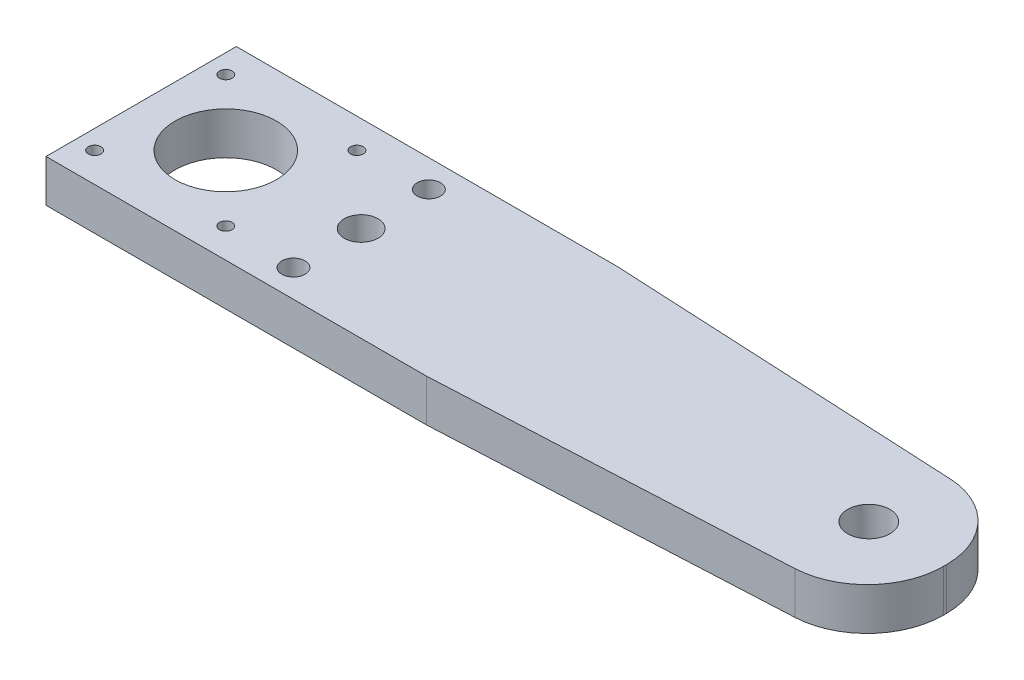
ISO-10303-21;
HEADER;
FILE_DESCRIPTION(('STEP AP214'),'2;1');
FILE_NAME('part.step','',(''),(''),'','','');
FILE_SCHEMA(('AUTOMOTIVE_DESIGN { 1 0 10303 214 1 1 1 1 }'));
ENDSEC;
DATA;
#1=APPLICATION_CONTEXT('core data for automotive mechanical design processes');
#2=APPLICATION_PROTOCOL_DEFINITION('international standard','automotive_design',2000,#1);
#3=PRODUCT_CONTEXT('',#1,'mechanical');
#4=PRODUCT('Part','Part','',(#3));
#5=PRODUCT_RELATED_PRODUCT_CATEGORY('part','',(#4));
#6=PRODUCT_DEFINITION_FORMATION('','',#4);
#7=PRODUCT_DEFINITION_CONTEXT('part definition',#1,'design');
#8=PRODUCT_DEFINITION('design','',#6,#7);
#9=PRODUCT_DEFINITION_SHAPE('','',#8);
#10=(LENGTH_UNIT() NAMED_UNIT(*) SI_UNIT(.MILLI.,.METRE.));
#11=(NAMED_UNIT(*) PLANE_ANGLE_UNIT() SI_UNIT($,.RADIAN.));
#12=(NAMED_UNIT(*) SI_UNIT($,.STERADIAN.) SOLID_ANGLE_UNIT());
#13=UNCERTAINTY_MEASURE_WITH_UNIT(LENGTH_MEASURE(1.E-05),#10,'distance_accuracy_value','');
#14=(GEOMETRIC_REPRESENTATION_CONTEXT(3) GLOBAL_UNCERTAINTY_ASSIGNED_CONTEXT((#13)) GLOBAL_UNIT_ASSIGNED_CONTEXT((#10,
#11,#12)) REPRESENTATION_CONTEXT('',''));
#15=CARTESIAN_POINT('',(0.,0.,0.));
#16=DIRECTION('',(0.,0.,1.));
#17=DIRECTION('',(1.,0.,0.));
#18=AXIS2_PLACEMENT_3D('',#15,#16,#17);
#19=CARTESIAN_POINT('',(95.,10.,-22.5));
#20=DIRECTION('',(-1.,0.,0.));
#21=DIRECTION('',(0.,0.,1.));
#22=AXIS2_PLACEMENT_3D('',#19,#20,#21);
#23=PLANE('',#22);
#24=DIRECTION('',(0.,0.,-1.));
#25=VECTOR('',#24,1.);
#26=CARTESIAN_POINT('',(95.,0.,-22.5));
#27=LINE('',#26,#25);
#28=CARTESIAN_POINT('',(95.,0.,0.377514044949283));
#29=VERTEX_POINT('',#28);
#30=CARTESIAN_POINT('',(95.,0.,-0.377514044949311));
#31=VERTEX_POINT('',#30);
#32=EDGE_CURVE('E139',#29,#31,#27,.T.);
#33=ORIENTED_EDGE('',*,*,#32,.T.);
#34=DIRECTION('',(0.,1.,0.));
#35=VECTOR('',#34,1.);
#36=CARTESIAN_POINT('',(95.,10.,-0.377514044949304));
#37=LINE('',#36,#35);
#38=CARTESIAN_POINT('',(95.,10.,-0.377514044949311));
#39=VERTEX_POINT('',#38);
#40=EDGE_CURVE('E153',#31,#39,#37,.T.);
#41=ORIENTED_EDGE('',*,*,#40,.T.);
#42=DIRECTION('',(0.,0.,-1.));
#43=VECTOR('',#42,1.);
#44=CARTESIAN_POINT('',(95.,10.,-22.5));
#45=LINE('',#44,#43);
#46=CARTESIAN_POINT('',(95.,10.,0.377514044949283));
#47=VERTEX_POINT('',#46);
#48=EDGE_CURVE('E147',#47,#39,#45,.T.);
#49=ORIENTED_EDGE('',*,*,#48,.F.);
#50=DIRECTION('',(0.,1.,0.));
#51=VECTOR('',#50,1.);
#52=CARTESIAN_POINT('',(95.,10.,0.37751404494929));
#53=LINE('',#52,#51);
#54=EDGE_CURVE('E151',#47,#29,#53,.F.);
#55=ORIENTED_EDGE('',*,*,#54,.T.);
#56=EDGE_LOOP('',(#33,#41,#49,#55));
#57=FACE_BOUND('',#56,.T.);
#58=ADVANCED_FACE('F38',(#57),#23,.F.);
#59=CARTESIAN_POINT('',(-95.,10.,-22.5));
#60=DIRECTION('',(0.,0.,1.));
#61=DIRECTION('',(1.,0.,0.));
#62=AXIS2_PLACEMENT_3D('',#59,#60,#61);
#63=PLANE('',#62);
#64=DIRECTION('',(-1.,0.,0.));
#65=VECTOR('',#64,1.);
#66=CARTESIAN_POINT('',(-95.,10.,-22.5));
#67=LINE('',#66,#65);
#68=CARTESIAN_POINT('',(-4.99999999999999,10.,-22.5));
#69=VERTEX_POINT('',#68);
#70=CARTESIAN_POINT('',(-95.,10.,-22.5));
#71=VERTEX_POINT('',#70);
#72=EDGE_CURVE('E135',#69,#71,#67,.T.);
#73=ORIENTED_EDGE('',*,*,#72,.F.);
#74=DIRECTION('',(0.,1.,0.));
#75=VECTOR('',#74,1.);
#76=CARTESIAN_POINT('',(-4.99999999999999,0.,-22.5));
#77=LINE('',#76,#75);
#78=CARTESIAN_POINT('',(-4.99999999999999,0.,-22.5));
#79=VERTEX_POINT('',#78);
#80=EDGE_CURVE('E114',#79,#69,#77,.T.);
#81=ORIENTED_EDGE('',*,*,#80,.F.);
#82=DIRECTION('',(-1.,0.,0.));
#83=VECTOR('',#82,1.);
#84=CARTESIAN_POINT('',(-95.,0.,-22.5));
#85=LINE('',#84,#83);
#86=CARTESIAN_POINT('',(-95.,0.,-22.5));
#87=VERTEX_POINT('',#86);
#88=EDGE_CURVE('E142',#79,#87,#85,.T.);
#89=ORIENTED_EDGE('',*,*,#88,.T.);
#90=DIRECTION('',(0.,-1.,0.));
#91=VECTOR('',#90,1.);
#92=CARTESIAN_POINT('',(-95.,10.,-22.5));
#93=LINE('',#92,#91);
#94=EDGE_CURVE('E133',#71,#87,#93,.T.);
#95=ORIENTED_EDGE('',*,*,#94,.F.);
#96=EDGE_LOOP('',(#73,#81,#89,#95));
#97=FACE_BOUND('',#96,.T.);
#98=ADVANCED_FACE('F234',(#97),#63,.F.);
#99=CARTESIAN_POINT('',(-95.,10.,-22.5));
#100=DIRECTION('',(1.,0.,0.));
#101=DIRECTION('',(0.,0.,-1.));
#102=AXIS2_PLACEMENT_3D('',#99,#100,#101);
#103=PLANE('',#102);
#104=DIRECTION('',(0.,0.,1.));
#105=VECTOR('',#104,1.);
#106=CARTESIAN_POINT('',(-95.,0.,-22.5));
#107=LINE('',#106,#105);
#108=CARTESIAN_POINT('',(-95.,0.,22.5));
#109=VERTEX_POINT('',#108);
#110=EDGE_CURVE('E145',#87,#109,#107,.T.);
#111=ORIENTED_EDGE('',*,*,#110,.T.);
#112=DIRECTION('',(0.,-1.,0.));
#113=VECTOR('',#112,1.);
#114=CARTESIAN_POINT('',(-95.,10.,22.5));
#115=LINE('',#114,#113);
#116=CARTESIAN_POINT('',(-95.,10.,22.5));
#117=VERTEX_POINT('',#116);
#118=EDGE_CURVE('E131',#117,#109,#115,.T.);
#119=ORIENTED_EDGE('',*,*,#118,.F.);
#120=DIRECTION('',(0.,0.,1.));
#121=VECTOR('',#120,1.);
#122=CARTESIAN_POINT('',(-95.,10.,-22.5));
#123=LINE('',#122,#121);
#124=EDGE_CURVE('E129',#71,#117,#123,.T.);
#125=ORIENTED_EDGE('',*,*,#124,.F.);
#126=ORIENTED_EDGE('',*,*,#94,.T.);
#127=EDGE_LOOP('',(#111,#119,#125,#126));
#128=FACE_BOUND('',#127,.T.);
#129=ADVANCED_FACE('F237',(#128),#103,.F.);
#130=CARTESIAN_POINT('',(-95.,10.,22.5));
#131=DIRECTION('',(0.,0.,-1.));
#132=DIRECTION('',(-1.,0.,0.));
#133=AXIS2_PLACEMENT_3D('',#130,#131,#132);
#134=PLANE('',#133);
#135=DIRECTION('',(1.,0.,0.));
#136=VECTOR('',#135,1.);
#137=CARTESIAN_POINT('',(-95.,0.,22.5));
#138=LINE('',#137,#136);
#139=CARTESIAN_POINT('',(-5.00000000001302,0.,22.5000000000003));
#140=VERTEX_POINT('',#139);
#141=EDGE_CURVE('E122',#109,#140,#138,.T.);
#142=ORIENTED_EDGE('',*,*,#141,.T.);
#143=DIRECTION('',(0.,1.,0.));
#144=VECTOR('',#143,1.);
#145=CARTESIAN_POINT('',(-4.99999999999999,0.,22.5));
#146=LINE('',#145,#144);
#147=CARTESIAN_POINT('',(-4.99999999999999,10.,22.5));
#148=VERTEX_POINT('',#147);
#149=EDGE_CURVE('E108',#140,#148,#146,.T.);
#150=ORIENTED_EDGE('',*,*,#149,.T.);
#151=DIRECTION('',(1.,0.,0.));
#152=VECTOR('',#151,1.);
#153=CARTESIAN_POINT('',(-95.,10.,22.5));
#154=LINE('',#153,#152);
#155=EDGE_CURVE('E120',#117,#148,#154,.T.);
#156=ORIENTED_EDGE('',*,*,#155,.F.);
#157=ORIENTED_EDGE('',*,*,#118,.T.);
#158=EDGE_LOOP('',(#142,#150,#156,#157));
#159=FACE_BOUND('',#158,.T.);
#160=ADVANCED_FACE('F118',(#159),#134,.F.);
#161=CARTESIAN_POINT('',(0.,10.,0.));
#162=DIRECTION('',(0.,1.,0.));
#163=DIRECTION('',(0.,0.,1.));
#164=AXIS2_PLACEMENT_3D('',#161,#162,#163);
#165=PLANE('',#164);
#166=ORIENTED_EDGE('',*,*,#48,.T.);
#167=CARTESIAN_POINT('',(77.,10.,-0.377514044949297));
#168=DIRECTION('',(0.,1.,0.));
#169=DIRECTION('',(0.,0.,1.));
#170=AXIS2_PLACEMENT_3D('',#167,#168,#169);
#171=CIRCLE('',#170,18.);
#172=CARTESIAN_POINT('',(77.89887710499,10.,-18.3550561447505));
#173=VERTEX_POINT('',#172);
#174=EDGE_CURVE('E158',#39,#173,#171,.T.);
#175=ORIENTED_EDGE('',*,*,#174,.T.);
#176=DIRECTION('',(0.998752338877845,0.,0.0499376169438922));
#177=VECTOR('',#176,1.);
#178=CARTESIAN_POINT('',(-4.99999999999999,10.,-22.5));
#179=LINE('',#178,#177);
#180=EDGE_CURVE('E172',#69,#173,#179,.T.);
#181=ORIENTED_EDGE('',*,*,#180,.F.);
#182=ORIENTED_EDGE('',*,*,#72,.T.);
#183=ORIENTED_EDGE('',*,*,#124,.T.);
#184=ORIENTED_EDGE('',*,*,#155,.T.);
#185=DIRECTION('',(-0.998752338877845,0.,0.0499376169438922));
#186=VECTOR('',#185,1.);
#187=CARTESIAN_POINT('',(-4.99999999999999,10.,22.5));
#188=LINE('',#187,#186);
#189=CARTESIAN_POINT('',(77.89887710499,10.,18.3550561447505));
#190=VERTEX_POINT('',#189);
#191=EDGE_CURVE('E105',#190,#148,#188,.T.);
#192=ORIENTED_EDGE('',*,*,#191,.F.);
#193=CARTESIAN_POINT('',(77.,10.,0.377514044949297));
#194=DIRECTION('',(0.,1.,0.));
#195=DIRECTION('',(0.,0.,1.));
#196=AXIS2_PLACEMENT_3D('',#193,#194,#195);
#197=CIRCLE('',#196,18.);
#198=EDGE_CURVE('E156',#190,#47,#197,.T.);
#199=ORIENTED_EDGE('',*,*,#198,.T.);
#200=EDGE_LOOP('',(#166,#175,#181,#182,#183,#184,#192,#199));
#201=FACE_BOUND('',#200,.T.);
#202=CARTESIAN_POINT('',(-43.,10.,0.));
#203=DIRECTION('',(0.,1.,0.));
#204=DIRECTION('',(0.,0.,1.));
#205=AXIS2_PLACEMENT_3D('',#202,#203,#204);
#206=CIRCLE('',#205,4.);
#207=CARTESIAN_POINT('',(-43.,10.,4.));
#208=VERTEX_POINT('',#207);
#209=EDGE_CURVE('E220',#208,#208,#206,.T.);
#210=ORIENTED_EDGE('',*,*,#209,.F.);
#211=EDGE_LOOP('',(#210));
#212=FACE_BOUND('',#211,.T.);
#213=CARTESIAN_POINT('',(-43.,10.,-16.));
#214=DIRECTION('',(0.,1.,0.));
#215=DIRECTION('',(0.,0.,1.));
#216=AXIS2_PLACEMENT_3D('',#213,#214,#215);
#217=CIRCLE('',#216,2.75);
#218=CARTESIAN_POINT('',(-43.,10.,-13.25));
#219=VERTEX_POINT('',#218);
#220=EDGE_CURVE('E209',#219,#219,#217,.T.);
#221=ORIENTED_EDGE('',*,*,#220,.F.);
#222=EDGE_LOOP('',(#221));
#223=FACE_BOUND('',#222,.T.);
#224=CARTESIAN_POINT('',(-43.,10.,16.));
#225=DIRECTION('',(0.,1.,0.));
#226=DIRECTION('',(0.,0.,-1.));
#227=AXIS2_PLACEMENT_3D('',#224,#225,#226);
#228=CIRCLE('',#227,2.75);
#229=CARTESIAN_POINT('',(-43.,10.,13.25));
#230=VERTEX_POINT('',#229);
#231=EDGE_CURVE('E210',#230,#230,#228,.T.);
#232=ORIENTED_EDGE('',*,*,#231,.F.);
#233=EDGE_LOOP('',(#232));
#234=FACE_BOUND('',#233,.T.);
#235=CARTESIAN_POINT('',(77.,10.,0.));
#236=DIRECTION('',(0.,1.,0.));
#237=DIRECTION('',(0.,0.,1.));
#238=AXIS2_PLACEMENT_3D('',#235,#236,#237);
#239=CIRCLE('',#238,5.);
#240=CARTESIAN_POINT('',(77.,10.,5.));
#241=VERTEX_POINT('',#240);
#242=EDGE_CURVE('E123',#241,#241,#239,.T.);
#243=ORIENTED_EDGE('',*,*,#242,.F.);
#244=EDGE_LOOP('',(#243));
#245=FACE_BOUND('',#244,.T.);
#246=CARTESIAN_POINT('',(-59.5,10.,-15.5));
#247=DIRECTION('',(0.,1.,0.));
#248=DIRECTION('',(0.,0.,1.));
#249=AXIS2_PLACEMENT_3D('',#246,#247,#248);
#250=CIRCLE('',#249,1.5);
#251=CARTESIAN_POINT('',(-59.5,10.,-14.));
#252=VERTEX_POINT('',#251);
#253=EDGE_CURVE('E198',#252,#252,#250,.T.);
#254=ORIENTED_EDGE('',*,*,#253,.F.);
#255=EDGE_LOOP('',(#254));
#256=FACE_BOUND('',#255,.T.);
#257=CARTESIAN_POINT('',(-90.5,10.,15.5));
#258=DIRECTION('',(0.,1.,0.));
#259=DIRECTION('',(0.,0.,1.));
#260=AXIS2_PLACEMENT_3D('',#257,#258,#259);
#261=CIRCLE('',#260,1.5);
#262=CARTESIAN_POINT('',(-90.5,10.,17.));
#263=VERTEX_POINT('',#262);
#264=EDGE_CURVE('E183',#263,#263,#261,.T.);
#265=ORIENTED_EDGE('',*,*,#264,.F.);
#266=EDGE_LOOP('',(#265));
#267=FACE_BOUND('',#266,.T.);
#268=CARTESIAN_POINT('',(-59.5,10.,15.5));
#269=DIRECTION('',(0.,1.,0.));
#270=DIRECTION('',(0.,0.,1.));
#271=AXIS2_PLACEMENT_3D('',#268,#269,#270);
#272=CIRCLE('',#271,1.5);
#273=CARTESIAN_POINT('',(-59.5,10.,17.));
#274=VERTEX_POINT('',#273);
#275=EDGE_CURVE('E184',#274,#274,#272,.T.);
#276=ORIENTED_EDGE('',*,*,#275,.F.);
#277=EDGE_LOOP('',(#276));
#278=FACE_BOUND('',#277,.T.);
#279=CARTESIAN_POINT('',(-75.,10.,0.));
#280=DIRECTION('',(0.,1.,0.));
#281=DIRECTION('',(0.,0.,1.));
#282=AXIS2_PLACEMENT_3D('',#279,#280,#281);
#283=CIRCLE('',#282,12.);
#284=CARTESIAN_POINT('',(-75.,10.,12.));
#285=VERTEX_POINT('',#284);
#286=EDGE_CURVE('E190',#285,#285,#283,.T.);
#287=ORIENTED_EDGE('',*,*,#286,.F.);
#288=EDGE_LOOP('',(#287));
#289=FACE_BOUND('',#288,.T.);
#290=CARTESIAN_POINT('',(-90.5,10.,-15.5));
#291=DIRECTION('',(0.,1.,0.));
#292=DIRECTION('',(0.,0.,1.));
#293=AXIS2_PLACEMENT_3D('',#290,#291,#292);
#294=CIRCLE('',#293,1.5);
#295=CARTESIAN_POINT('',(-90.5,10.,-14.));
#296=VERTEX_POINT('',#295);
#297=EDGE_CURVE('E197',#296,#296,#294,.T.);
#298=ORIENTED_EDGE('',*,*,#297,.F.);
#299=EDGE_LOOP('',(#298));
#300=FACE_BOUND('',#299,.T.);
#301=ADVANCED_FACE('F126',(#201,#212,#223,#234,#245,#256,#267,#278,#289,#300),#165,.T.);
#302=CARTESIAN_POINT('',(0.,0.,0.));
#303=DIRECTION('',(0.,1.,0.));
#304=DIRECTION('',(0.,0.,1.));
#305=AXIS2_PLACEMENT_3D('',#302,#303,#304);
#306=PLANE('',#305);
#307=CARTESIAN_POINT('',(-43.,0.,0.));
#308=DIRECTION('',(0.,1.,0.));
#309=DIRECTION('',(0.,0.,1.));
#310=AXIS2_PLACEMENT_3D('',#307,#308,#309);
#311=CIRCLE('',#310,4.);
#312=CARTESIAN_POINT('',(-43.,0.,4.));
#313=VERTEX_POINT('',#312);
#314=EDGE_CURVE('E193',#313,#313,#311,.T.);
#315=ORIENTED_EDGE('',*,*,#314,.T.);
#316=EDGE_LOOP('',(#315));
#317=FACE_BOUND('',#316,.T.);
#318=CARTESIAN_POINT('',(-43.,0.,-16.));
#319=DIRECTION('',(0.,1.,0.));
#320=DIRECTION('',(0.,0.,1.));
#321=AXIS2_PLACEMENT_3D('',#318,#319,#320);
#322=CIRCLE('',#321,2.75);
#323=CARTESIAN_POINT('',(-43.,0.,-13.25));
#324=VERTEX_POINT('',#323);
#325=EDGE_CURVE('E223',#324,#324,#322,.T.);
#326=ORIENTED_EDGE('',*,*,#325,.T.);
#327=EDGE_LOOP('',(#326));
#328=FACE_BOUND('',#327,.T.);
#329=CARTESIAN_POINT('',(-43.,0.,16.));
#330=DIRECTION('',(0.,1.,0.));
#331=DIRECTION('',(0.,0.,-1.));
#332=AXIS2_PLACEMENT_3D('',#329,#330,#331);
#333=CIRCLE('',#332,2.75);
#334=CARTESIAN_POINT('',(-43.,0.,13.25));
#335=VERTEX_POINT('',#334);
#336=EDGE_CURVE('E206',#335,#335,#333,.T.);
#337=ORIENTED_EDGE('',*,*,#336,.T.);
#338=EDGE_LOOP('',(#337));
#339=FACE_BOUND('',#338,.T.);
#340=CARTESIAN_POINT('',(77.,0.,0.));
#341=DIRECTION('',(0.,1.,0.));
#342=DIRECTION('',(0.,0.,1.));
#343=AXIS2_PLACEMENT_3D('',#340,#341,#342);
#344=CIRCLE('',#343,5.);
#345=CARTESIAN_POINT('',(77.,0.,5.));
#346=VERTEX_POINT('',#345);
#347=EDGE_CURVE('E213',#346,#346,#344,.T.);
#348=ORIENTED_EDGE('',*,*,#347,.T.);
#349=EDGE_LOOP('',(#348));
#350=FACE_BOUND('',#349,.T.);
#351=CARTESIAN_POINT('',(-59.5,0.,-15.5));
#352=DIRECTION('',(0.,1.,0.));
#353=DIRECTION('',(0.,0.,1.));
#354=AXIS2_PLACEMENT_3D('',#351,#352,#353);
#355=CIRCLE('',#354,1.5);
#356=CARTESIAN_POINT('',(-59.5,0.,-14.));
#357=VERTEX_POINT('',#356);
#358=EDGE_CURVE('E194',#357,#357,#355,.T.);
#359=ORIENTED_EDGE('',*,*,#358,.T.);
#360=EDGE_LOOP('',(#359));
#361=FACE_BOUND('',#360,.T.);
#362=CARTESIAN_POINT('',(-90.5,0.,15.5));
#363=DIRECTION('',(0.,1.,0.));
#364=DIRECTION('',(0.,0.,1.));
#365=AXIS2_PLACEMENT_3D('',#362,#363,#364);
#366=CIRCLE('',#365,1.5);
#367=CARTESIAN_POINT('',(-90.5,0.,17.));
#368=VERTEX_POINT('',#367);
#369=EDGE_CURVE('E201',#368,#368,#366,.T.);
#370=ORIENTED_EDGE('',*,*,#369,.T.);
#371=EDGE_LOOP('',(#370));
#372=FACE_BOUND('',#371,.T.);
#373=CARTESIAN_POINT('',(-59.5,0.,15.5));
#374=DIRECTION('',(0.,1.,0.));
#375=DIRECTION('',(0.,0.,1.));
#376=AXIS2_PLACEMENT_3D('',#373,#374,#375);
#377=CIRCLE('',#376,1.5);
#378=CARTESIAN_POINT('',(-59.5,0.,17.));
#379=VERTEX_POINT('',#378);
#380=EDGE_CURVE('E180',#379,#379,#377,.T.);
#381=ORIENTED_EDGE('',*,*,#380,.T.);
#382=EDGE_LOOP('',(#381));
#383=FACE_BOUND('',#382,.T.);
#384=CARTESIAN_POINT('',(-75.,0.,0.));
#385=DIRECTION('',(0.,1.,0.));
#386=DIRECTION('',(0.,0.,1.));
#387=AXIS2_PLACEMENT_3D('',#384,#385,#386);
#388=CIRCLE('',#387,12.);
#389=CARTESIAN_POINT('',(-75.,0.,12.));
#390=VERTEX_POINT('',#389);
#391=EDGE_CURVE('E187',#390,#390,#388,.T.);
#392=ORIENTED_EDGE('',*,*,#391,.T.);
#393=EDGE_LOOP('',(#392));
#394=FACE_BOUND('',#393,.T.);
#395=CARTESIAN_POINT('',(-90.5,0.,-15.5));
#396=DIRECTION('',(0.,1.,0.));
#397=DIRECTION('',(0.,0.,1.));
#398=AXIS2_PLACEMENT_3D('',#395,#396,#397);
#399=CIRCLE('',#398,1.5);
#400=CARTESIAN_POINT('',(-90.5,0.,-14.));
#401=VERTEX_POINT('',#400);
#402=EDGE_CURVE('E143',#401,#401,#399,.T.);
#403=ORIENTED_EDGE('',*,*,#402,.T.);
#404=EDGE_LOOP('',(#403));
#405=FACE_BOUND('',#404,.T.);
#406=DIRECTION('',(0.998752338877845,0.,0.0499376169438922));
#407=VECTOR('',#406,1.);
#408=CARTESIAN_POINT('',(-4.99999999999999,0.,-22.5));
#409=LINE('',#408,#407);
#410=CARTESIAN_POINT('',(77.89887710499,0.,-18.3550561447505));
#411=VERTEX_POINT('',#410);
#412=EDGE_CURVE('E164',#79,#411,#409,.T.);
#413=ORIENTED_EDGE('',*,*,#412,.T.);
#414=CARTESIAN_POINT('',(77.,0.,-0.377514044949297));
#415=DIRECTION('',(0.,1.,0.));
#416=DIRECTION('',(0.,0.,1.));
#417=AXIS2_PLACEMENT_3D('',#414,#415,#416);
#418=CIRCLE('',#417,18.);
#419=EDGE_CURVE('E46',#411,#31,#418,.F.);
#420=ORIENTED_EDGE('',*,*,#419,.T.);
#421=ORIENTED_EDGE('',*,*,#32,.F.);
#422=CARTESIAN_POINT('',(77.,0.,0.377514044949297));
#423=DIRECTION('',(0.,1.,0.));
#424=DIRECTION('',(0.,0.,1.));
#425=AXIS2_PLACEMENT_3D('',#422,#423,#424);
#426=CIRCLE('',#425,18.);
#427=CARTESIAN_POINT('',(77.89887710499,0.,18.3550561447505));
#428=VERTEX_POINT('',#427);
#429=EDGE_CURVE('E53',#29,#428,#426,.F.);
#430=ORIENTED_EDGE('',*,*,#429,.T.);
#431=DIRECTION('',(-0.998752338877845,0.,0.0499376169438922));
#432=VECTOR('',#431,1.);
#433=CARTESIAN_POINT('',(-4.99999999999999,0.,22.5));
#434=LINE('',#433,#432);
#435=EDGE_CURVE('E113',#428,#140,#434,.T.);
#436=ORIENTED_EDGE('',*,*,#435,.T.);
#437=ORIENTED_EDGE('',*,*,#141,.F.);
#438=ORIENTED_EDGE('',*,*,#110,.F.);
#439=ORIENTED_EDGE('',*,*,#88,.F.);
#440=EDGE_LOOP('',(#413,#420,#421,#430,#436,#437,#438,#439));
#441=FACE_BOUND('',#440,.T.);
#442=ADVANCED_FACE('F162',(#317,#328,#339,#350,#361,#372,#383,#394,#405,#441),#306,.F.);
#443=CARTESIAN_POINT('',(-90.5,0.,-15.5));
#444=DIRECTION('',(0.,1.,0.));
#445=DIRECTION('',(0.,0.,1.));
#446=AXIS2_PLACEMENT_3D('',#443,#444,#445);
#447=CYLINDRICAL_SURFACE('',#446,1.5);
#448=ORIENTED_EDGE('',*,*,#402,.F.);
#449=EDGE_LOOP('',(#448));
#450=FACE_BOUND('',#449,.T.);
#451=ORIENTED_EDGE('',*,*,#297,.T.);
#452=EDGE_LOOP('',(#451));
#453=FACE_BOUND('',#452,.T.);
#454=ADVANCED_FACE('F257',(#450,#453),#447,.F.);
#455=CARTESIAN_POINT('',(-75.,0.,0.));
#456=DIRECTION('',(0.,1.,0.));
#457=DIRECTION('',(0.,0.,1.));
#458=AXIS2_PLACEMENT_3D('',#455,#456,#457);
#459=CYLINDRICAL_SURFACE('',#458,12.);
#460=ORIENTED_EDGE('',*,*,#391,.F.);
#461=EDGE_LOOP('',(#460));
#462=FACE_BOUND('',#461,.T.);
#463=ORIENTED_EDGE('',*,*,#286,.T.);
#464=EDGE_LOOP('',(#463));
#465=FACE_BOUND('',#464,.T.);
#466=ADVANCED_FACE('F263',(#462,#465),#459,.F.);
#467=CARTESIAN_POINT('',(-59.5,0.,15.5));
#468=DIRECTION('',(0.,1.,0.));
#469=DIRECTION('',(0.,0.,1.));
#470=AXIS2_PLACEMENT_3D('',#467,#468,#469);
#471=CYLINDRICAL_SURFACE('',#470,1.5);
#472=ORIENTED_EDGE('',*,*,#380,.F.);
#473=EDGE_LOOP('',(#472));
#474=FACE_BOUND('',#473,.T.);
#475=ORIENTED_EDGE('',*,*,#275,.T.);
#476=EDGE_LOOP('',(#475));
#477=FACE_BOUND('',#476,.T.);
#478=ADVANCED_FACE('F285',(#474,#477),#471,.F.);
#479=CARTESIAN_POINT('',(-90.5,0.,15.5));
#480=DIRECTION('',(0.,1.,0.));
#481=DIRECTION('',(0.,0.,1.));
#482=AXIS2_PLACEMENT_3D('',#479,#480,#481);
#483=CYLINDRICAL_SURFACE('',#482,1.5);
#484=ORIENTED_EDGE('',*,*,#369,.F.);
#485=EDGE_LOOP('',(#484));
#486=FACE_BOUND('',#485,.T.);
#487=ORIENTED_EDGE('',*,*,#264,.T.);
#488=EDGE_LOOP('',(#487));
#489=FACE_BOUND('',#488,.T.);
#490=ADVANCED_FACE('F282',(#486,#489),#483,.F.);
#491=CARTESIAN_POINT('',(-59.5,0.,-15.5));
#492=DIRECTION('',(0.,1.,0.));
#493=DIRECTION('',(0.,0.,1.));
#494=AXIS2_PLACEMENT_3D('',#491,#492,#493);
#495=CYLINDRICAL_SURFACE('',#494,1.5);
#496=ORIENTED_EDGE('',*,*,#358,.F.);
#497=EDGE_LOOP('',(#496));
#498=FACE_BOUND('',#497,.T.);
#499=ORIENTED_EDGE('',*,*,#253,.T.);
#500=EDGE_LOOP('',(#499));
#501=FACE_BOUND('',#500,.T.);
#502=ADVANCED_FACE('F277',(#498,#501),#495,.F.);
#503=CARTESIAN_POINT('',(77.,0.,0.));
#504=DIRECTION('',(0.,1.,0.));
#505=DIRECTION('',(0.,0.,1.));
#506=AXIS2_PLACEMENT_3D('',#503,#504,#505);
#507=CYLINDRICAL_SURFACE('',#506,5.);
#508=ORIENTED_EDGE('',*,*,#347,.F.);
#509=EDGE_LOOP('',(#508));
#510=FACE_BOUND('',#509,.T.);
#511=ORIENTED_EDGE('',*,*,#242,.T.);
#512=EDGE_LOOP('',(#511));
#513=FACE_BOUND('',#512,.T.);
#514=ADVANCED_FACE('F274',(#510,#513),#507,.F.);
#515=CARTESIAN_POINT('',(-43.,0.,16.));
#516=DIRECTION('',(0.,1.,0.));
#517=DIRECTION('',(0.,0.,1.));
#518=AXIS2_PLACEMENT_3D('',#515,#516,#517);
#519=CYLINDRICAL_SURFACE('',#518,2.75);
#520=ORIENTED_EDGE('',*,*,#336,.F.);
#521=EDGE_LOOP('',(#520));
#522=FACE_BOUND('',#521,.T.);
#523=ORIENTED_EDGE('',*,*,#231,.T.);
#524=EDGE_LOOP('',(#523));
#525=FACE_BOUND('',#524,.T.);
#526=ADVANCED_FACE('F269',(#522,#525),#519,.F.);
#527=CARTESIAN_POINT('',(-43.,0.,-16.));
#528=DIRECTION('',(0.,1.,0.));
#529=DIRECTION('',(0.,0.,1.));
#530=AXIS2_PLACEMENT_3D('',#527,#528,#529);
#531=CYLINDRICAL_SURFACE('',#530,2.75);
#532=ORIENTED_EDGE('',*,*,#325,.F.);
#533=EDGE_LOOP('',(#532));
#534=FACE_BOUND('',#533,.T.);
#535=ORIENTED_EDGE('',*,*,#220,.T.);
#536=EDGE_LOOP('',(#535));
#537=FACE_BOUND('',#536,.T.);
#538=ADVANCED_FACE('F265',(#534,#537),#531,.F.);
#539=CARTESIAN_POINT('',(-43.,0.,0.));
#540=DIRECTION('',(0.,1.,0.));
#541=DIRECTION('',(0.,0.,1.));
#542=AXIS2_PLACEMENT_3D('',#539,#540,#541);
#543=CYLINDRICAL_SURFACE('',#542,4.);
#544=ORIENTED_EDGE('',*,*,#314,.F.);
#545=EDGE_LOOP('',(#544));
#546=FACE_BOUND('',#545,.T.);
#547=ORIENTED_EDGE('',*,*,#209,.T.);
#548=EDGE_LOOP('',(#547));
#549=FACE_BOUND('',#548,.T.);
#550=ADVANCED_FACE('F268',(#546,#549),#543,.F.);
#551=CARTESIAN_POINT('',(-4.99999999999999,0.,-22.5));
#552=DIRECTION('',(-0.0499376169438922,0.,0.998752338877845));
#553=DIRECTION('',(0.998752338877845,0.,0.0499376169438923));
#554=AXIS2_PLACEMENT_3D('',#551,#552,#553);
#555=PLANE('',#554);
#556=ORIENTED_EDGE('',*,*,#180,.T.);
#557=DIRECTION('',(0.,1.,0.));
#558=VECTOR('',#557,1.);
#559=CARTESIAN_POINT('',(77.8988771049901,0.,-18.3550561447505));
#560=LINE('',#559,#558);
#561=EDGE_CURVE('E61',#173,#411,#560,.F.);
#562=ORIENTED_EDGE('',*,*,#561,.T.);
#563=ORIENTED_EDGE('',*,*,#412,.F.);
#564=ORIENTED_EDGE('',*,*,#80,.T.);
#565=EDGE_LOOP('',(#556,#562,#563,#564));
#566=FACE_BOUND('',#565,.T.);
#567=ADVANCED_FACE('F174',(#566),#555,.F.);
#568=CARTESIAN_POINT('',(-4.99999999999999,0.,22.5));
#569=DIRECTION('',(-0.0499376169438922,0.,-0.998752338877845));
#570=DIRECTION('',(-0.998752338877845,0.,0.0499376169438923));
#571=AXIS2_PLACEMENT_3D('',#568,#569,#570);
#572=PLANE('',#571);
#573=ORIENTED_EDGE('',*,*,#435,.F.);
#574=DIRECTION('',(0.,1.,0.));
#575=VECTOR('',#574,1.);
#576=CARTESIAN_POINT('',(77.8988771049901,0.,18.3550561447505));
#577=LINE('',#576,#575);
#578=EDGE_CURVE('E11',#428,#190,#577,.T.);
#579=ORIENTED_EDGE('',*,*,#578,.T.);
#580=ORIENTED_EDGE('',*,*,#191,.T.);
#581=ORIENTED_EDGE('',*,*,#149,.F.);
#582=EDGE_LOOP('',(#573,#579,#580,#581));
#583=FACE_BOUND('',#582,.T.);
#584=ADVANCED_FACE('F107',(#583),#572,.F.);
#585=CARTESIAN_POINT('',(77.,10.,-0.377514044949297));
#586=DIRECTION('',(0.,1.,0.));
#587=DIRECTION('',(0.,0.,1.));
#588=AXIS2_PLACEMENT_3D('',#585,#586,#587);
#589=CYLINDRICAL_SURFACE('',#588,18.);
#590=ORIENTED_EDGE('',*,*,#419,.F.);
#591=ORIENTED_EDGE('',*,*,#561,.F.);
#592=ORIENTED_EDGE('',*,*,#174,.F.);
#593=ORIENTED_EDGE('',*,*,#40,.F.);
#594=EDGE_LOOP('',(#590,#591,#592,#593));
#595=FACE_BOUND('',#594,.T.);
#596=ADVANCED_FACE('F170',(#595),#589,.T.);
#597=CARTESIAN_POINT('',(77.,0.,0.377514044949297));
#598=DIRECTION('',(0.,1.,0.));
#599=DIRECTION('',(0.,0.,1.));
#600=AXIS2_PLACEMENT_3D('',#597,#598,#599);
#601=CYLINDRICAL_SURFACE('',#600,18.);
#602=ORIENTED_EDGE('',*,*,#429,.F.);
#603=ORIENTED_EDGE('',*,*,#54,.F.);
#604=ORIENTED_EDGE('',*,*,#198,.F.);
#605=ORIENTED_EDGE('',*,*,#578,.F.);
#606=EDGE_LOOP('',(#602,#603,#604,#605));
#607=FACE_BOUND('',#606,.T.);
#608=ADVANCED_FACE('F40',(#607),#601,.T.);
#609=CLOSED_SHELL('',(#58,#98,#129,#160,#301,#442,#454,#466,#478,#490,#502,#514,#526,#538,#550,
#567,#584,#596,#608));
#610=MANIFOLD_SOLID_BREP('B2',#609);
#611=ADVANCED_BREP_SHAPE_REPRESENTATION('',(#18,#610),#14);
#612=SHAPE_DEFINITION_REPRESENTATION(#9,#611);
ENDSEC;
END-ISO-10303-21;
